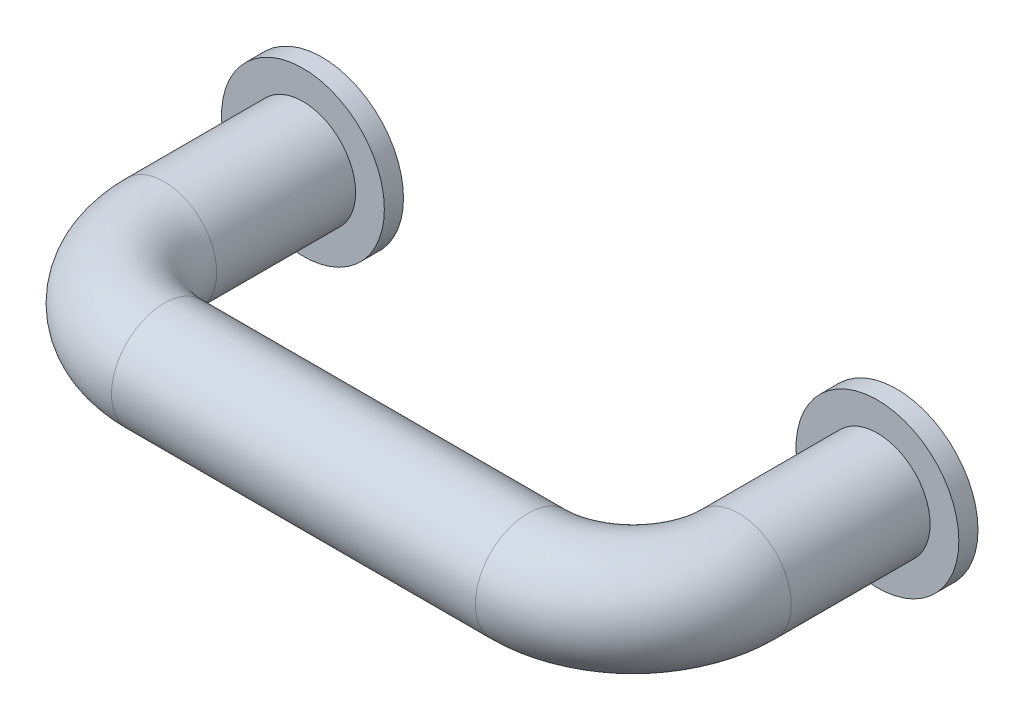
ISO-10303-21;
HEADER;
FILE_DESCRIPTION(('STEP AP214'),'2;1');
FILE_NAME('part.step','',(''),(''),'','','');
FILE_SCHEMA(('AUTOMOTIVE_DESIGN { 1 0 10303 214 1 1 1 1 }'));
ENDSEC;
DATA;
#1=APPLICATION_CONTEXT('core data for automotive mechanical design processes');
#2=APPLICATION_PROTOCOL_DEFINITION('international standard','automotive_design',2000,#1);
#3=PRODUCT_CONTEXT('',#1,'mechanical');
#4=PRODUCT('Part','Part','',(#3));
#5=PRODUCT_RELATED_PRODUCT_CATEGORY('part','',(#4));
#6=PRODUCT_DEFINITION_FORMATION('','',#4);
#7=PRODUCT_DEFINITION_CONTEXT('part definition',#1,'design');
#8=PRODUCT_DEFINITION('design','',#6,#7);
#9=PRODUCT_DEFINITION_SHAPE('','',#8);
#10=(LENGTH_UNIT() NAMED_UNIT(*) SI_UNIT(.MILLI.,.METRE.));
#11=(NAMED_UNIT(*) PLANE_ANGLE_UNIT() SI_UNIT($,.RADIAN.));
#12=(NAMED_UNIT(*) SI_UNIT($,.STERADIAN.) SOLID_ANGLE_UNIT());
#13=UNCERTAINTY_MEASURE_WITH_UNIT(LENGTH_MEASURE(1.E-05),#10,'distance_accuracy_value','');
#14=(GEOMETRIC_REPRESENTATION_CONTEXT(3) GLOBAL_UNCERTAINTY_ASSIGNED_CONTEXT((#13)) GLOBAL_UNIT_ASSIGNED_CONTEXT((#10,
#11,#12)) REPRESENTATION_CONTEXT('',''));
#15=CARTESIAN_POINT('',(0.,0.,0.));
#16=DIRECTION('',(0.,0.,1.));
#17=DIRECTION('',(1.,0.,0.));
#18=AXIS2_PLACEMENT_3D('',#15,#16,#17);
#19=CARTESIAN_POINT('',(-60.,0.,4.));
#20=DIRECTION('',(0.,0.,-1.));
#21=DIRECTION('',(-1.,0.,0.));
#22=AXIS2_PLACEMENT_3D('',#19,#20,#21);
#23=CYLINDRICAL_SURFACE('',#22,17.);
#24=CARTESIAN_POINT('',(-60.,0.,4.));
#25=DIRECTION('',(0.,0.,1.));
#26=DIRECTION('',(1.,0.,0.));
#27=AXIS2_PLACEMENT_3D('',#24,#25,#26);
#28=CIRCLE('',#27,17.);
#29=CARTESIAN_POINT('',(-43.,0.,4.));
#30=VERTEX_POINT('',#29);
#31=EDGE_CURVE('E11',#30,#30,#28,.T.);
#32=ORIENTED_EDGE('',*,*,#31,.F.);
#33=EDGE_LOOP('',(#32));
#34=FACE_BOUND('',#33,.T.);
#35=CARTESIAN_POINT('',(-60.,0.,0.));
#36=DIRECTION('',(0.,0.,1.));
#37=DIRECTION('',(1.,0.,0.));
#38=AXIS2_PLACEMENT_3D('',#35,#36,#37);
#39=CIRCLE('',#38,17.);
#40=CARTESIAN_POINT('',(-43.,0.,0.));
#41=VERTEX_POINT('',#40);
#42=EDGE_CURVE('E57',#41,#41,#39,.T.);
#43=ORIENTED_EDGE('',*,*,#42,.T.);
#44=EDGE_LOOP('',(#43));
#45=FACE_BOUND('',#44,.T.);
#46=ADVANCED_FACE('F52',(#34,#45),#23,.T.);
#47=CARTESIAN_POINT('',(-60.,0.,4.));
#48=DIRECTION('',(0.,0.,1.));
#49=DIRECTION('',(1.,0.,0.));
#50=AXIS2_PLACEMENT_3D('',#47,#48,#49);
#51=PLANE('',#50);
#52=CARTESIAN_POINT('',(-60.,0.,4.));
#53=DIRECTION('',(0.,0.,1.));
#54=DIRECTION('',(1.,0.,0.));
#55=AXIS2_PLACEMENT_3D('',#52,#53,#54);
#56=CIRCLE('',#55,11.);
#57=CARTESIAN_POINT('',(-49.,0.,4.));
#58=VERTEX_POINT('',#57);
#59=EDGE_CURVE('E65',#58,#58,#56,.F.);
#60=ORIENTED_EDGE('',*,*,#59,.T.);
#61=EDGE_LOOP('',(#60));
#62=FACE_BOUND('',#61,.T.);
#63=ORIENTED_EDGE('',*,*,#31,.T.);
#64=EDGE_LOOP('',(#63));
#65=FACE_BOUND('',#64,.T.);
#66=ADVANCED_FACE('F106',(#62,#65),#51,.T.);
#67=CARTESIAN_POINT('',(-60.,0.,0.));
#68=DIRECTION('',(0.,0.,1.));
#69=DIRECTION('',(1.,0.,0.));
#70=AXIS2_PLACEMENT_3D('',#67,#68,#69);
#71=PLANE('',#70);
#72=ORIENTED_EDGE('',*,*,#42,.F.);
#73=EDGE_LOOP('',(#72));
#74=FACE_BOUND('',#73,.T.);
#75=ADVANCED_FACE('F114',(#74),#71,.F.);
#76=CARTESIAN_POINT('',(60.,0.,4.));
#77=DIRECTION('',(0.,0.,-1.));
#78=DIRECTION('',(-1.,0.,0.));
#79=AXIS2_PLACEMENT_3D('',#76,#77,#78);
#80=CYLINDRICAL_SURFACE('',#79,17.);
#81=CARTESIAN_POINT('',(60.,0.,4.));
#82=DIRECTION('',(0.,0.,1.));
#83=DIRECTION('',(1.,0.,0.));
#84=AXIS2_PLACEMENT_3D('',#81,#82,#83);
#85=CIRCLE('',#84,17.);
#86=CARTESIAN_POINT('',(77.,0.,4.));
#87=VERTEX_POINT('',#86);
#88=EDGE_CURVE('E69',#87,#87,#85,.T.);
#89=ORIENTED_EDGE('',*,*,#88,.F.);
#90=EDGE_LOOP('',(#89));
#91=FACE_BOUND('',#90,.T.);
#92=CARTESIAN_POINT('',(60.,0.,0.));
#93=DIRECTION('',(0.,0.,1.));
#94=DIRECTION('',(1.,0.,0.));
#95=AXIS2_PLACEMENT_3D('',#92,#93,#94);
#96=CIRCLE('',#95,17.);
#97=CARTESIAN_POINT('',(77.,0.,0.));
#98=VERTEX_POINT('',#97);
#99=EDGE_CURVE('E70',#98,#98,#96,.T.);
#100=ORIENTED_EDGE('',*,*,#99,.T.);
#101=EDGE_LOOP('',(#100));
#102=FACE_BOUND('',#101,.T.);
#103=ADVANCED_FACE('F117',(#91,#102),#80,.T.);
#104=CARTESIAN_POINT('',(60.,0.,4.));
#105=DIRECTION('',(0.,0.,1.));
#106=DIRECTION('',(1.,0.,0.));
#107=AXIS2_PLACEMENT_3D('',#104,#105,#106);
#108=PLANE('',#107);
#109=CARTESIAN_POINT('',(60.,0.,4.));
#110=DIRECTION('',(0.,0.,1.));
#111=DIRECTION('',(1.,0.,0.));
#112=AXIS2_PLACEMENT_3D('',#109,#110,#111);
#113=CIRCLE('',#112,11.);
#114=CARTESIAN_POINT('',(71.,0.,4.));
#115=VERTEX_POINT('',#114);
#116=EDGE_CURVE('E72',#115,#115,#113,.F.);
#117=ORIENTED_EDGE('',*,*,#116,.T.);
#118=EDGE_LOOP('',(#117));
#119=FACE_BOUND('',#118,.T.);
#120=ORIENTED_EDGE('',*,*,#88,.T.);
#121=EDGE_LOOP('',(#120));
#122=FACE_BOUND('',#121,.T.);
#123=ADVANCED_FACE('F125',(#119,#122),#108,.T.);
#124=CARTESIAN_POINT('',(60.,0.,0.));
#125=DIRECTION('',(0.,0.,1.));
#126=DIRECTION('',(1.,0.,0.));
#127=AXIS2_PLACEMENT_3D('',#124,#125,#126);
#128=PLANE('',#127);
#129=ORIENTED_EDGE('',*,*,#99,.F.);
#130=EDGE_LOOP('',(#129));
#131=FACE_BOUND('',#130,.T.);
#132=ADVANCED_FACE('F105',(#131),#128,.F.);
#133=CARTESIAN_POINT('',(-60.,0.,0.));
#134=DIRECTION('',(0.,0.,1.));
#135=DIRECTION('',(1.,0.,0.));
#136=AXIS2_PLACEMENT_3D('',#133,#134,#135);
#137=CYLINDRICAL_SURFACE('',#136,11.);
#138=ORIENTED_EDGE('',*,*,#59,.F.);
#139=EDGE_LOOP('',(#138));
#140=FACE_BOUND('',#139,.T.);
#141=CARTESIAN_POINT('',(-60.,0.,33.));
#142=DIRECTION('',(0.,0.,-1.));
#143=DIRECTION('',(-1.,0.,0.));
#144=AXIS2_PLACEMENT_3D('',#141,#142,#143);
#145=CIRCLE('',#144,11.);
#146=CARTESIAN_POINT('',(-71.,0.,33.));
#147=VERTEX_POINT('',#146);
#148=EDGE_CURVE('E83',#147,#147,#145,.T.);
#149=ORIENTED_EDGE('',*,*,#148,.T.);
#150=EDGE_LOOP('',(#149));
#151=FACE_BOUND('',#150,.T.);
#152=ADVANCED_FACE('F90',(#140,#151),#137,.T.);
#153=CARTESIAN_POINT('',(-38.,0.,33.));
#154=DIRECTION('',(0.,1.,0.));
#155=DIRECTION('',(0.,0.,1.));
#156=AXIS2_PLACEMENT_3D('',#153,#154,#155);
#157=TOROIDAL_SURFACE('',#156,22.,11.);
#158=CARTESIAN_POINT('',(-38.,0.,55.));
#159=DIRECTION('',(-1.,0.,0.));
#160=DIRECTION('',(0.,0.,1.));
#161=AXIS2_PLACEMENT_3D('',#158,#159,#160);
#162=CIRCLE('',#161,11.);
#163=CARTESIAN_POINT('',(-38.,0.,66.));
#164=VERTEX_POINT('',#163);
#165=EDGE_CURVE('E84',#164,#164,#162,.T.);
#166=CARTESIAN_POINT('',(-38.,0.,33.));
#167=DIRECTION('',(0.,1.,0.));
#168=DIRECTION('',(0.,0.,1.));
#169=AXIS2_PLACEMENT_3D('',#166,#167,#168);
#170=CIRCLE('',#169,33.);
#171=EDGE_CURVE('',#147,#164,#170,.T.);
#172=ORIENTED_EDGE('',*,*,#148,.F.);
#173=ORIENTED_EDGE('',*,*,#165,.T.);
#174=ORIENTED_EDGE('',*,*,#171,.T.);
#175=ORIENTED_EDGE('',*,*,#171,.F.);
#176=EDGE_LOOP('',(#172,#174,#173,#175));
#177=FACE_BOUND('',#176,.T.);
#178=ADVANCED_FACE('F93',(#177),#157,.T.);
#179=CARTESIAN_POINT('',(-38.,0.,55.));
#180=DIRECTION('',(1.,0.,0.));
#181=DIRECTION('',(0.,0.,-1.));
#182=AXIS2_PLACEMENT_3D('',#179,#180,#181);
#183=CYLINDRICAL_SURFACE('',#182,11.);
#184=CARTESIAN_POINT('',(38.,0.,55.));
#185=DIRECTION('',(-1.,0.,0.));
#186=DIRECTION('',(0.,0.,1.));
#187=AXIS2_PLACEMENT_3D('',#184,#185,#186);
#188=CIRCLE('',#187,11.);
#189=CARTESIAN_POINT('',(38.,0.,66.));
#190=VERTEX_POINT('',#189);
#191=EDGE_CURVE('E78',#190,#190,#188,.T.);
#192=ORIENTED_EDGE('',*,*,#191,.T.);
#193=EDGE_LOOP('',(#192));
#194=FACE_BOUND('',#193,.T.);
#195=ORIENTED_EDGE('',*,*,#165,.F.);
#196=EDGE_LOOP('',(#195));
#197=FACE_BOUND('',#196,.T.);
#198=ADVANCED_FACE('F91',(#194,#197),#183,.T.);
#199=CARTESIAN_POINT('',(38.,0.,33.));
#200=DIRECTION('',(0.,1.,0.));
#201=DIRECTION('',(0.,0.,1.));
#202=AXIS2_PLACEMENT_3D('',#199,#200,#201);
#203=TOROIDAL_SURFACE('',#202,22.,11.);
#204=CARTESIAN_POINT('',(60.,0.,33.));
#205=DIRECTION('',(0.,0.,1.));
#206=DIRECTION('',(1.,0.,0.));
#207=AXIS2_PLACEMENT_3D('',#204,#205,#206);
#208=CIRCLE('',#207,11.);
#209=CARTESIAN_POINT('',(71.,0.,33.));
#210=VERTEX_POINT('',#209);
#211=EDGE_CURVE('E79',#210,#210,#208,.T.);
#212=CARTESIAN_POINT('',(38.,0.,33.));
#213=DIRECTION('',(0.,1.,0.));
#214=DIRECTION('',(0.,0.,1.));
#215=AXIS2_PLACEMENT_3D('',#212,#213,#214);
#216=CIRCLE('',#215,33.);
#217=EDGE_CURVE('',#190,#210,#216,.T.);
#218=ORIENTED_EDGE('',*,*,#191,.F.);
#219=ORIENTED_EDGE('',*,*,#211,.T.);
#220=ORIENTED_EDGE('',*,*,#217,.T.);
#221=ORIENTED_EDGE('',*,*,#217,.F.);
#222=EDGE_LOOP('',(#218,#220,#219,#221));
#223=FACE_BOUND('',#222,.T.);
#224=ADVANCED_FACE('F97',(#223),#203,.T.);
#225=CARTESIAN_POINT('',(60.,0.,33.));
#226=DIRECTION('',(0.,0.,-1.));
#227=DIRECTION('',(-1.,0.,0.));
#228=AXIS2_PLACEMENT_3D('',#225,#226,#227);
#229=CYLINDRICAL_SURFACE('',#228,11.);
#230=ORIENTED_EDGE('',*,*,#116,.F.);
#231=EDGE_LOOP('',(#230));
#232=FACE_BOUND('',#231,.T.);
#233=ORIENTED_EDGE('',*,*,#211,.F.);
#234=EDGE_LOOP('',(#233));
#235=FACE_BOUND('',#234,.T.);
#236=ADVANCED_FACE('F128',(#232,#235),#229,.T.);
#237=CLOSED_SHELL('',(#46,#66,#75,#103,#123,#132,#152,#178,#198,#224,#236));
#238=MANIFOLD_SOLID_BREP('B2',#237);
#239=ADVANCED_BREP_SHAPE_REPRESENTATION('',(#18,#238),#14);
#240=SHAPE_DEFINITION_REPRESENTATION(#9,#239);
ENDSEC;
END-ISO-10303-21;
